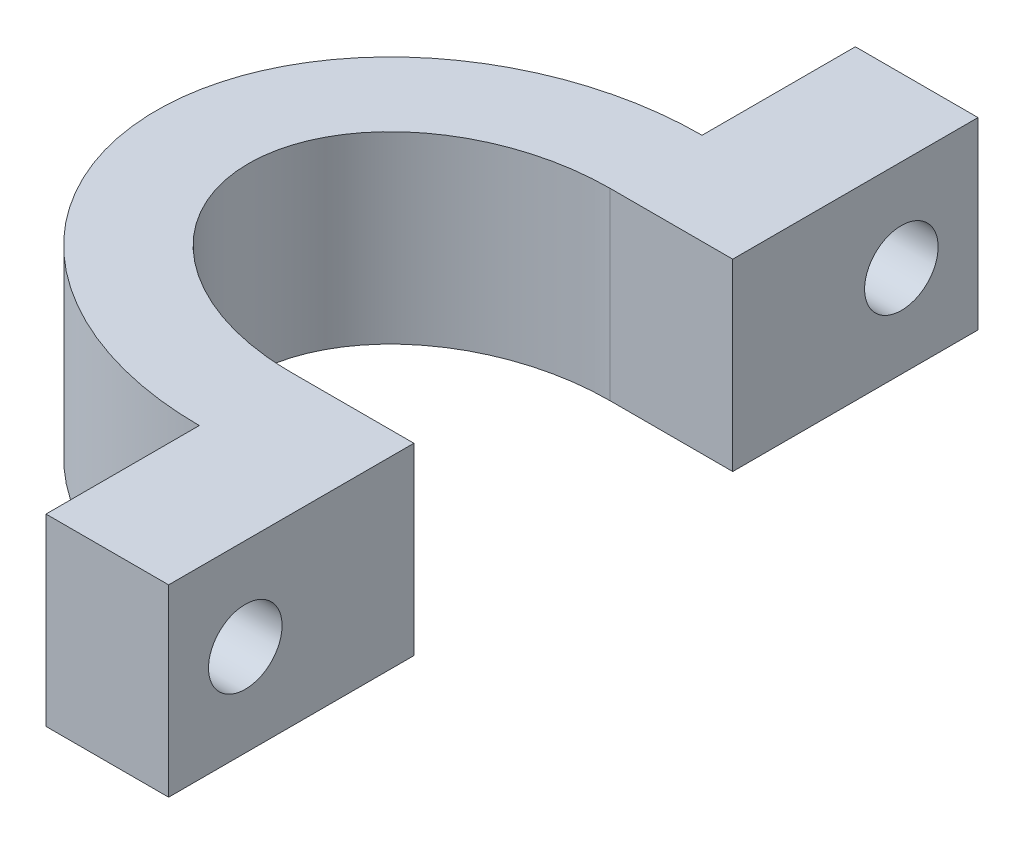
ISO-10303-21;
HEADER;
FILE_DESCRIPTION(('STEP AP214'),'2;1');
FILE_NAME('part.step','',(''),(''),'','','');
FILE_SCHEMA(('AUTOMOTIVE_DESIGN { 1 0 10303 214 1 1 1 1 }'));
ENDSEC;
DATA;
#1=APPLICATION_CONTEXT('core data for automotive mechanical design processes');
#2=APPLICATION_PROTOCOL_DEFINITION('international standard','automotive_design',2000,#1);
#3=PRODUCT_CONTEXT('',#1,'mechanical');
#4=PRODUCT('Part','Part','',(#3));
#5=PRODUCT_RELATED_PRODUCT_CATEGORY('part','',(#4));
#6=PRODUCT_DEFINITION_FORMATION('','',#4);
#7=PRODUCT_DEFINITION_CONTEXT('part definition',#1,'design');
#8=PRODUCT_DEFINITION('design','',#6,#7);
#9=PRODUCT_DEFINITION_SHAPE('','',#8);
#10=(LENGTH_UNIT() NAMED_UNIT(*) SI_UNIT(.MILLI.,.METRE.));
#11=(NAMED_UNIT(*) PLANE_ANGLE_UNIT() SI_UNIT($,.RADIAN.));
#12=(NAMED_UNIT(*) SI_UNIT($,.STERADIAN.) SOLID_ANGLE_UNIT());
#13=UNCERTAINTY_MEASURE_WITH_UNIT(LENGTH_MEASURE(1.E-05),#10,'distance_accuracy_value','');
#14=(GEOMETRIC_REPRESENTATION_CONTEXT(3) GLOBAL_UNCERTAINTY_ASSIGNED_CONTEXT((#13)) GLOBAL_UNIT_ASSIGNED_CONTEXT((#10,
#11,#12)) REPRESENTATION_CONTEXT('',''));
#15=CARTESIAN_POINT('',(0.,0.,0.));
#16=DIRECTION('',(0.,0.,1.));
#17=DIRECTION('',(1.,0.,0.));
#18=AXIS2_PLACEMENT_3D('',#15,#16,#17);
#19=CARTESIAN_POINT('',(0.,15.,0.));
#20=DIRECTION('',(0.,1.,0.));
#21=DIRECTION('',(1.,0.,0.));
#22=AXIS2_PLACEMENT_3D('',#19,#20,#21);
#23=ELLIPSE('',#22,24.,20.5);
#24=DIRECTION('',(0.,-1.,0.));
#25=VECTOR('',#24,1.);
#26=SURFACE_OF_LINEAR_EXTRUSION('',#23,#25);
#27=CARTESIAN_POINT('',(0.,0.,0.));
#28=DIRECTION('',(0.,1.,0.));
#29=DIRECTION('',(1.,0.,0.));
#30=AXIS2_PLACEMENT_3D('',#27,#28,#29);
#31=ELLIPSE('',#30,24.,20.5);
#32=CARTESIAN_POINT('',(0.,0.,-20.5));
#33=VERTEX_POINT('',#32);
#34=CARTESIAN_POINT('',(0.,0.,20.5));
#35=VERTEX_POINT('',#34);
#36=EDGE_CURVE('E150',#33,#35,#31,.T.);
#37=ORIENTED_EDGE('',*,*,#36,.T.);
#38=DIRECTION('',(0.,-1.,0.));
#39=VECTOR('',#38,1.);
#40=CARTESIAN_POINT('',(0.,15.,20.5));
#41=LINE('',#40,#39);
#42=CARTESIAN_POINT('',(0.,15.,20.5));
#43=VERTEX_POINT('',#42);
#44=EDGE_CURVE('E56',#43,#35,#41,.T.);
#45=ORIENTED_EDGE('',*,*,#44,.F.);
#46=CARTESIAN_POINT('',(0.,15.,-20.5));
#47=VERTEX_POINT('',#46);
#48=EDGE_CURVE('E196',#47,#43,#23,.T.);
#49=ORIENTED_EDGE('',*,*,#48,.F.);
#50=DIRECTION('',(0.,-1.,0.));
#51=VECTOR('',#50,1.);
#52=CARTESIAN_POINT('',(0.,15.,-20.5));
#53=LINE('',#52,#51);
#54=EDGE_CURVE('E11',#47,#33,#53,.T.);
#55=ORIENTED_EDGE('',*,*,#54,.T.);
#56=EDGE_LOOP('',(#37,#45,#49,#55));
#57=FACE_BOUND('',#56,.T.);
#58=ADVANCED_FACE('F47',(#57),#26,.F.);
#59=CARTESIAN_POINT('',(0.,15.,0.));
#60=DIRECTION('',(0.,1.,0.));
#61=DIRECTION('',(1.,0.,0.));
#62=AXIS2_PLACEMENT_3D('',#59,#60,#61);
#63=ELLIPSE('',#62,16.5,13.);
#64=DIRECTION('',(0.,-1.,0.));
#65=VECTOR('',#64,1.);
#66=SURFACE_OF_LINEAR_EXTRUSION('',#63,#65);
#67=CARTESIAN_POINT('',(0.,0.,0.));
#68=DIRECTION('',(0.,1.,0.));
#69=DIRECTION('',(1.,0.,0.));
#70=AXIS2_PLACEMENT_3D('',#67,#68,#69);
#71=ELLIPSE('',#70,16.5,13.);
#72=CARTESIAN_POINT('',(0.,0.,-13.));
#73=VERTEX_POINT('',#72);
#74=CARTESIAN_POINT('',(0.,0.,13.));
#75=VERTEX_POINT('',#74);
#76=EDGE_CURVE('E155',#73,#75,#71,.T.);
#77=ORIENTED_EDGE('',*,*,#76,.F.);
#78=DIRECTION('',(0.,-1.,0.));
#79=VECTOR('',#78,1.);
#80=CARTESIAN_POINT('',(0.,15.,-13.));
#81=LINE('',#80,#79);
#82=CARTESIAN_POINT('',(0.,15.,-13.));
#83=VERTEX_POINT('',#82);
#84=EDGE_CURVE('E63',#83,#73,#81,.T.);
#85=ORIENTED_EDGE('',*,*,#84,.F.);
#86=CARTESIAN_POINT('',(0.,15.,13.));
#87=VERTEX_POINT('',#86);
#88=EDGE_CURVE('E201',#83,#87,#63,.T.);
#89=ORIENTED_EDGE('',*,*,#88,.T.);
#90=DIRECTION('',(0.,-1.,0.));
#91=VECTOR('',#90,1.);
#92=CARTESIAN_POINT('',(0.,15.,13.));
#93=LINE('',#92,#91);
#94=EDGE_CURVE('E305',#87,#75,#93,.T.);
#95=ORIENTED_EDGE('',*,*,#94,.T.);
#96=EDGE_LOOP('',(#77,#85,#89,#95));
#97=FACE_BOUND('',#96,.T.);
#98=ADVANCED_FACE('F206',(#97),#66,.T.);
#99=CARTESIAN_POINT('',(0.,15.,0.));
#100=DIRECTION('',(0.,1.,0.));
#101=DIRECTION('',(0.,0.,1.));
#102=AXIS2_PLACEMENT_3D('',#99,#100,#101);
#103=PLANE('',#102);
#104=ORIENTED_EDGE('',*,*,#88,.F.);
#105=DIRECTION('',(-1.,0.,0.));
#106=VECTOR('',#105,1.);
#107=CARTESIAN_POINT('',(10.,15.,-13.));
#108=LINE('',#107,#106);
#109=CARTESIAN_POINT('',(10.,15.,-13.));
#110=VERTEX_POINT('',#109);
#111=EDGE_CURVE('E277',#110,#83,#108,.T.);
#112=ORIENTED_EDGE('',*,*,#111,.F.);
#113=DIRECTION('',(0.,0.,1.));
#114=VECTOR('',#113,1.);
#115=CARTESIAN_POINT('',(10.,15.,-13.));
#116=LINE('',#115,#114);
#117=CARTESIAN_POINT('',(10.,15.,-33.));
#118=VERTEX_POINT('',#117);
#119=EDGE_CURVE('E143',#118,#110,#116,.T.);
#120=ORIENTED_EDGE('',*,*,#119,.F.);
#121=DIRECTION('',(-1.,0.,0.));
#122=VECTOR('',#121,1.);
#123=CARTESIAN_POINT('',(10.,15.,-33.));
#124=LINE('',#123,#122);
#125=CARTESIAN_POINT('',(0.,15.,-33.));
#126=VERTEX_POINT('',#125);
#127=EDGE_CURVE('E157',#118,#126,#124,.T.);
#128=ORIENTED_EDGE('',*,*,#127,.T.);
#129=DIRECTION('',(0.,0.,1.));
#130=VECTOR('',#129,1.);
#131=CARTESIAN_POINT('',(0.,15.,-13.));
#132=LINE('',#131,#130);
#133=EDGE_CURVE('E146',#126,#47,#132,.T.);
#134=ORIENTED_EDGE('',*,*,#133,.T.);
#135=ORIENTED_EDGE('',*,*,#48,.T.);
#136=DIRECTION('',(0.,0.,1.));
#137=VECTOR('',#136,1.);
#138=CARTESIAN_POINT('',(0.,15.,13.));
#139=LINE('',#138,#137);
#140=CARTESIAN_POINT('',(0.,15.,33.));
#141=VERTEX_POINT('',#140);
#142=EDGE_CURVE('E182',#43,#141,#139,.T.);
#143=ORIENTED_EDGE('',*,*,#142,.T.);
#144=DIRECTION('',(-1.,0.,0.));
#145=VECTOR('',#144,1.);
#146=CARTESIAN_POINT('',(10.,15.,33.));
#147=LINE('',#146,#145);
#148=CARTESIAN_POINT('',(10.,15.,33.));
#149=VERTEX_POINT('',#148);
#150=EDGE_CURVE('E164',#149,#141,#147,.T.);
#151=ORIENTED_EDGE('',*,*,#150,.F.);
#152=DIRECTION('',(0.,0.,1.));
#153=VECTOR('',#152,1.);
#154=CARTESIAN_POINT('',(10.,15.,13.));
#155=LINE('',#154,#153);
#156=CARTESIAN_POINT('',(10.,15.,13.));
#157=VERTEX_POINT('',#156);
#158=EDGE_CURVE('E191',#157,#149,#155,.T.);
#159=ORIENTED_EDGE('',*,*,#158,.F.);
#160=DIRECTION('',(-1.,0.,0.));
#161=VECTOR('',#160,1.);
#162=CARTESIAN_POINT('',(10.,15.,13.));
#163=LINE('',#162,#161);
#164=EDGE_CURVE('E161',#157,#87,#163,.T.);
#165=ORIENTED_EDGE('',*,*,#164,.T.);
#166=EDGE_LOOP('',(#104,#112,#120,#128,#134,#135,#143,#151,#159,#165));
#167=FACE_BOUND('',#166,.T.);
#168=ADVANCED_FACE('F209',(#167),#103,.T.);
#169=CARTESIAN_POINT('',(0.,0.,0.));
#170=DIRECTION('',(0.,1.,0.));
#171=DIRECTION('',(0.,0.,1.));
#172=AXIS2_PLACEMENT_3D('',#169,#170,#171);
#173=PLANE('',#172);
#174=ORIENTED_EDGE('',*,*,#36,.F.);
#175=DIRECTION('',(0.,0.,-1.));
#176=VECTOR('',#175,1.);
#177=CARTESIAN_POINT('',(0.,0.,-13.));
#178=LINE('',#177,#176);
#179=CARTESIAN_POINT('',(0.,0.,-33.));
#180=VERTEX_POINT('',#179);
#181=EDGE_CURVE('E185',#33,#180,#178,.T.);
#182=ORIENTED_EDGE('',*,*,#181,.T.);
#183=DIRECTION('',(-1.,0.,0.));
#184=VECTOR('',#183,1.);
#185=CARTESIAN_POINT('',(10.,0.,-33.));
#186=LINE('',#185,#184);
#187=CARTESIAN_POINT('',(10.,0.,-33.));
#188=VERTEX_POINT('',#187);
#189=EDGE_CURVE('E133',#188,#180,#186,.T.);
#190=ORIENTED_EDGE('',*,*,#189,.F.);
#191=DIRECTION('',(0.,0.,-1.));
#192=VECTOR('',#191,1.);
#193=CARTESIAN_POINT('',(10.,0.,-13.));
#194=LINE('',#193,#192);
#195=CARTESIAN_POINT('',(10.,0.,-13.));
#196=VERTEX_POINT('',#195);
#197=EDGE_CURVE('E126',#196,#188,#194,.T.);
#198=ORIENTED_EDGE('',*,*,#197,.F.);
#199=DIRECTION('',(-1.,0.,0.));
#200=VECTOR('',#199,1.);
#201=CARTESIAN_POINT('',(10.,0.,-13.));
#202=LINE('',#201,#200);
#203=EDGE_CURVE('E130',#196,#73,#202,.T.);
#204=ORIENTED_EDGE('',*,*,#203,.T.);
#205=ORIENTED_EDGE('',*,*,#76,.T.);
#206=DIRECTION('',(-1.,0.,0.));
#207=VECTOR('',#206,1.);
#208=CARTESIAN_POINT('',(10.,0.,13.));
#209=LINE('',#208,#207);
#210=CARTESIAN_POINT('',(10.,0.,13.));
#211=VERTEX_POINT('',#210);
#212=EDGE_CURVE('E172',#211,#75,#209,.T.);
#213=ORIENTED_EDGE('',*,*,#212,.F.);
#214=DIRECTION('',(0.,0.,-1.));
#215=VECTOR('',#214,1.);
#216=CARTESIAN_POINT('',(10.,0.,13.));
#217=LINE('',#216,#215);
#218=CARTESIAN_POINT('',(10.,0.,33.));
#219=VERTEX_POINT('',#218);
#220=EDGE_CURVE('E175',#219,#211,#217,.T.);
#221=ORIENTED_EDGE('',*,*,#220,.F.);
#222=DIRECTION('',(-1.,0.,0.));
#223=VECTOR('',#222,1.);
#224=CARTESIAN_POINT('',(10.,0.,33.));
#225=LINE('',#224,#223);
#226=CARTESIAN_POINT('',(0.,0.,33.));
#227=VERTEX_POINT('',#226);
#228=EDGE_CURVE('E169',#219,#227,#225,.T.);
#229=ORIENTED_EDGE('',*,*,#228,.T.);
#230=DIRECTION('',(0.,0.,-1.));
#231=VECTOR('',#230,1.);
#232=CARTESIAN_POINT('',(0.,0.,13.));
#233=LINE('',#232,#231);
#234=EDGE_CURVE('E71',#227,#35,#233,.T.);
#235=ORIENTED_EDGE('',*,*,#234,.T.);
#236=EDGE_LOOP('',(#174,#182,#190,#198,#204,#205,#213,#221,#229,#235));
#237=FACE_BOUND('',#236,.T.);
#238=ADVANCED_FACE('F128',(#237),#173,.F.);
#239=CARTESIAN_POINT('',(0.,0.,0.));
#240=DIRECTION('',(-1.,0.,0.));
#241=DIRECTION('',(0.,0.,1.));
#242=AXIS2_PLACEMENT_3D('',#239,#240,#241);
#243=PLANE('',#242);
#244=CARTESIAN_POINT('',(0.,7.5,26.75));
#245=DIRECTION('',(-1.,0.,0.));
#246=DIRECTION('',(0.,0.,-1.));
#247=AXIS2_PLACEMENT_3D('',#244,#245,#246);
#248=CIRCLE('',#247,3.);
#249=CARTESIAN_POINT('',(0.,7.5,23.75));
#250=VERTEX_POINT('',#249);
#251=EDGE_CURVE('E289',#250,#250,#248,.T.);
#252=ORIENTED_EDGE('',*,*,#251,.F.);
#253=EDGE_LOOP('',(#252));
#254=FACE_BOUND('',#253,.T.);
#255=ORIENTED_EDGE('',*,*,#44,.T.);
#256=ORIENTED_EDGE('',*,*,#234,.F.);
#257=DIRECTION('',(0.,-1.,0.));
#258=VECTOR('',#257,1.);
#259=CARTESIAN_POINT('',(0.,15.,33.));
#260=LINE('',#259,#258);
#261=EDGE_CURVE('E178',#141,#227,#260,.T.);
#262=ORIENTED_EDGE('',*,*,#261,.F.);
#263=ORIENTED_EDGE('',*,*,#142,.F.);
#264=EDGE_LOOP('',(#255,#256,#262,#263));
#265=FACE_BOUND('',#264,.T.);
#266=ADVANCED_FACE('F213',(#254,#265),#243,.T.);
#267=CARTESIAN_POINT('',(10.,15.,13.));
#268=DIRECTION('',(0.,0.,1.));
#269=DIRECTION('',(0.,-1.,0.));
#270=AXIS2_PLACEMENT_3D('',#267,#268,#269);
#271=PLANE('',#270);
#272=ORIENTED_EDGE('',*,*,#94,.F.);
#273=ORIENTED_EDGE('',*,*,#164,.F.);
#274=DIRECTION('',(0.,1.,0.));
#275=VECTOR('',#274,1.);
#276=CARTESIAN_POINT('',(10.,15.,13.));
#277=LINE('',#276,#275);
#278=EDGE_CURVE('E179',#211,#157,#277,.T.);
#279=ORIENTED_EDGE('',*,*,#278,.F.);
#280=ORIENTED_EDGE('',*,*,#212,.T.);
#281=EDGE_LOOP('',(#272,#273,#279,#280));
#282=FACE_BOUND('',#281,.T.);
#283=ADVANCED_FACE('F225',(#282),#271,.F.);
#284=CARTESIAN_POINT('',(10.,15.,33.));
#285=DIRECTION('',(0.,0.,-1.));
#286=DIRECTION('',(0.,1.,0.));
#287=AXIS2_PLACEMENT_3D('',#284,#285,#286);
#288=PLANE('',#287);
#289=ORIENTED_EDGE('',*,*,#261,.T.);
#290=ORIENTED_EDGE('',*,*,#228,.F.);
#291=DIRECTION('',(0.,-1.,0.));
#292=VECTOR('',#291,1.);
#293=CARTESIAN_POINT('',(10.,15.,33.));
#294=LINE('',#293,#292);
#295=EDGE_CURVE('E188',#149,#219,#294,.T.);
#296=ORIENTED_EDGE('',*,*,#295,.F.);
#297=ORIENTED_EDGE('',*,*,#150,.T.);
#298=EDGE_LOOP('',(#289,#290,#296,#297));
#299=FACE_BOUND('',#298,.T.);
#300=ADVANCED_FACE('F221',(#299),#288,.F.);
#301=CARTESIAN_POINT('',(10.,0.,0.));
#302=DIRECTION('',(-1.,0.,0.));
#303=DIRECTION('',(0.,0.,1.));
#304=AXIS2_PLACEMENT_3D('',#301,#302,#303);
#305=PLANE('',#304);
#306=CARTESIAN_POINT('',(10.,7.5,26.75));
#307=DIRECTION('',(-1.,0.,0.));
#308=DIRECTION('',(0.,0.,-1.));
#309=AXIS2_PLACEMENT_3D('',#306,#307,#308);
#310=CIRCLE('',#309,3.);
#311=CARTESIAN_POINT('',(10.,7.5,23.75));
#312=VERTEX_POINT('',#311);
#313=EDGE_CURVE('E285',#312,#312,#310,.T.);
#314=ORIENTED_EDGE('',*,*,#313,.T.);
#315=EDGE_LOOP('',(#314));
#316=FACE_BOUND('',#315,.T.);
#317=ORIENTED_EDGE('',*,*,#278,.T.);
#318=ORIENTED_EDGE('',*,*,#158,.T.);
#319=ORIENTED_EDGE('',*,*,#295,.T.);
#320=ORIENTED_EDGE('',*,*,#220,.T.);
#321=EDGE_LOOP('',(#317,#318,#319,#320));
#322=FACE_BOUND('',#321,.T.);
#323=ADVANCED_FACE('F217',(#316,#322),#305,.F.);
#324=CARTESIAN_POINT('',(0.,0.,0.));
#325=DIRECTION('',(1.,0.,0.));
#326=DIRECTION('',(0.,0.,-1.));
#327=AXIS2_PLACEMENT_3D('',#324,#325,#326);
#328=PLANE('',#327);
#329=CARTESIAN_POINT('',(0.,7.5,-26.75));
#330=DIRECTION('',(-1.,0.,0.));
#331=DIRECTION('',(0.,0.,1.));
#332=AXIS2_PLACEMENT_3D('',#329,#330,#331);
#333=CIRCLE('',#332,3.);
#334=CARTESIAN_POINT('',(0.,7.5,-23.75));
#335=VERTEX_POINT('',#334);
#336=EDGE_CURVE('E293',#335,#335,#333,.T.);
#337=ORIENTED_EDGE('',*,*,#336,.F.);
#338=EDGE_LOOP('',(#337));
#339=FACE_BOUND('',#338,.T.);
#340=ORIENTED_EDGE('',*,*,#181,.F.);
#341=ORIENTED_EDGE('',*,*,#54,.F.);
#342=ORIENTED_EDGE('',*,*,#133,.F.);
#343=DIRECTION('',(0.,1.,0.));
#344=VECTOR('',#343,1.);
#345=CARTESIAN_POINT('',(0.,15.,-33.));
#346=LINE('',#345,#344);
#347=EDGE_CURVE('E265',#180,#126,#346,.T.);
#348=ORIENTED_EDGE('',*,*,#347,.F.);
#349=EDGE_LOOP('',(#340,#341,#342,#348));
#350=FACE_BOUND('',#349,.T.);
#351=ADVANCED_FACE('F220',(#339,#350),#328,.F.);
#352=CARTESIAN_POINT('',(10.,15.,-13.));
#353=DIRECTION('',(0.,0.,-1.));
#354=DIRECTION('',(-1.,0.,0.));
#355=AXIS2_PLACEMENT_3D('',#352,#353,#354);
#356=PLANE('',#355);
#357=ORIENTED_EDGE('',*,*,#84,.T.);
#358=ORIENTED_EDGE('',*,*,#203,.F.);
#359=DIRECTION('',(0.,-1.,0.));
#360=VECTOR('',#359,1.);
#361=CARTESIAN_POINT('',(10.,15.,-13.));
#362=LINE('',#361,#360);
#363=EDGE_CURVE('E138',#110,#196,#362,.T.);
#364=ORIENTED_EDGE('',*,*,#363,.F.);
#365=ORIENTED_EDGE('',*,*,#111,.T.);
#366=EDGE_LOOP('',(#357,#358,#364,#365));
#367=FACE_BOUND('',#366,.T.);
#368=ADVANCED_FACE('F148',(#367),#356,.F.);
#369=CARTESIAN_POINT('',(10.,15.,-33.));
#370=DIRECTION('',(0.,0.,1.));
#371=DIRECTION('',(1.,0.,0.));
#372=AXIS2_PLACEMENT_3D('',#369,#370,#371);
#373=PLANE('',#372);
#374=ORIENTED_EDGE('',*,*,#347,.T.);
#375=ORIENTED_EDGE('',*,*,#127,.F.);
#376=DIRECTION('',(0.,1.,0.));
#377=VECTOR('',#376,1.);
#378=CARTESIAN_POINT('',(10.,15.,-33.));
#379=LINE('',#378,#377);
#380=EDGE_CURVE('E137',#188,#118,#379,.T.);
#381=ORIENTED_EDGE('',*,*,#380,.F.);
#382=ORIENTED_EDGE('',*,*,#189,.T.);
#383=EDGE_LOOP('',(#374,#375,#381,#382));
#384=FACE_BOUND('',#383,.T.);
#385=ADVANCED_FACE('F235',(#384),#373,.F.);
#386=CARTESIAN_POINT('',(10.,0.,0.));
#387=DIRECTION('',(1.,0.,0.));
#388=DIRECTION('',(0.,0.,-1.));
#389=AXIS2_PLACEMENT_3D('',#386,#387,#388);
#390=PLANE('',#389);
#391=CARTESIAN_POINT('',(10.,7.5,-26.75));
#392=DIRECTION('',(-1.,0.,0.));
#393=DIRECTION('',(0.,0.,1.));
#394=AXIS2_PLACEMENT_3D('',#391,#392,#393);
#395=CIRCLE('',#394,3.);
#396=CARTESIAN_POINT('',(10.,7.5,-23.75));
#397=VERTEX_POINT('',#396);
#398=EDGE_CURVE('E165',#397,#397,#395,.T.);
#399=ORIENTED_EDGE('',*,*,#398,.T.);
#400=EDGE_LOOP('',(#399));
#401=FACE_BOUND('',#400,.T.);
#402=ORIENTED_EDGE('',*,*,#363,.T.);
#403=ORIENTED_EDGE('',*,*,#197,.T.);
#404=ORIENTED_EDGE('',*,*,#380,.T.);
#405=ORIENTED_EDGE('',*,*,#119,.T.);
#406=EDGE_LOOP('',(#402,#403,#404,#405));
#407=FACE_BOUND('',#406,.T.);
#408=ADVANCED_FACE('F141',(#401,#407),#390,.T.);
#409=CARTESIAN_POINT('',(10.,7.5,-26.75));
#410=DIRECTION('',(-1.,0.,0.));
#411=DIRECTION('',(0.,0.,1.));
#412=AXIS2_PLACEMENT_3D('',#409,#410,#411);
#413=CYLINDRICAL_SURFACE('',#412,3.);
#414=ORIENTED_EDGE('',*,*,#398,.F.);
#415=EDGE_LOOP('',(#414));
#416=FACE_BOUND('',#415,.T.);
#417=ORIENTED_EDGE('',*,*,#336,.T.);
#418=EDGE_LOOP('',(#417));
#419=FACE_BOUND('',#418,.T.);
#420=ADVANCED_FACE('F244',(#416,#419),#413,.F.);
#421=CARTESIAN_POINT('',(10.,7.5,26.75));
#422=DIRECTION('',(-1.,0.,0.));
#423=DIRECTION('',(0.,0.,1.));
#424=AXIS2_PLACEMENT_3D('',#421,#422,#423);
#425=CYLINDRICAL_SURFACE('',#424,3.);
#426=ORIENTED_EDGE('',*,*,#313,.F.);
#427=EDGE_LOOP('',(#426));
#428=FACE_BOUND('',#427,.T.);
#429=ORIENTED_EDGE('',*,*,#251,.T.);
#430=EDGE_LOOP('',(#429));
#431=FACE_BOUND('',#430,.T.);
#432=ADVANCED_FACE('F246',(#428,#431),#425,.F.);
#433=CLOSED_SHELL('',(#58,#98,#168,#238,#266,#283,#300,#323,#351,#368,#385,#408,#420,#432));
#434=MANIFOLD_SOLID_BREP('B2',#433);
#435=ADVANCED_BREP_SHAPE_REPRESENTATION('',(#18,#434),#14);
#436=SHAPE_DEFINITION_REPRESENTATION(#9,#435);
ENDSEC;
END-ISO-10303-21;
